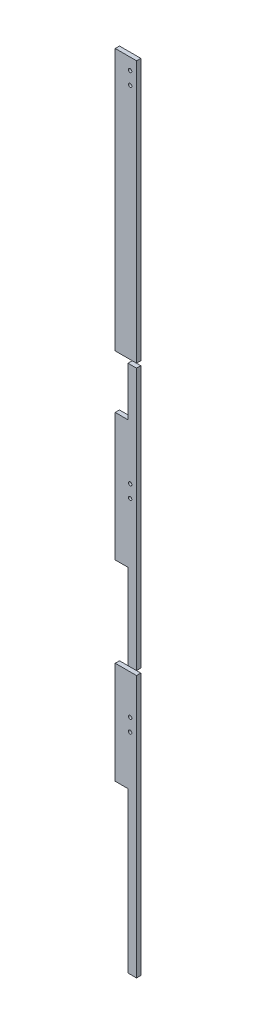
ISO-10303-21;
HEADER;
FILE_DESCRIPTION(('STEP AP214'),'2;1');
FILE_NAME('part.step','',(''),(''),'','','');
FILE_SCHEMA(('AUTOMOTIVE_DESIGN { 1 0 10303 214 1 1 1 1 }'));
ENDSEC;
DATA;
#1=APPLICATION_CONTEXT('core data for automotive mechanical design processes');
#2=APPLICATION_PROTOCOL_DEFINITION('international standard','automotive_design',2000,#1);
#3=PRODUCT_CONTEXT('',#1,'mechanical');
#4=PRODUCT('Part','Part','',(#3));
#5=PRODUCT_RELATED_PRODUCT_CATEGORY('part','',(#4));
#6=PRODUCT_DEFINITION_FORMATION('','',#4);
#7=PRODUCT_DEFINITION_CONTEXT('part definition',#1,'design');
#8=PRODUCT_DEFINITION('design','',#6,#7);
#9=PRODUCT_DEFINITION_SHAPE('','',#8);
#10=(LENGTH_UNIT() NAMED_UNIT(*) SI_UNIT(.MILLI.,.METRE.));
#11=(NAMED_UNIT(*) PLANE_ANGLE_UNIT() SI_UNIT($,.RADIAN.));
#12=(NAMED_UNIT(*) SI_UNIT($,.STERADIAN.) SOLID_ANGLE_UNIT());
#13=UNCERTAINTY_MEASURE_WITH_UNIT(LENGTH_MEASURE(1.E-05),#10,'distance_accuracy_value','');
#14=(GEOMETRIC_REPRESENTATION_CONTEXT(3) GLOBAL_UNCERTAINTY_ASSIGNED_CONTEXT((#13)) GLOBAL_UNIT_ASSIGNED_CONTEXT((#10,
#11,#12)) REPRESENTATION_CONTEXT('',''));
#15=CARTESIAN_POINT('',(0.,0.,0.));
#16=DIRECTION('',(0.,0.,1.));
#17=DIRECTION('',(1.,0.,0.));
#18=AXIS2_PLACEMENT_3D('',#15,#16,#17);
#19=CARTESIAN_POINT('',(0.,0.,2.));
#20=DIRECTION('',(0.,0.,-1.));
#21=DIRECTION('',(-1.,0.,0.));
#22=AXIS2_PLACEMENT_3D('',#19,#20,#21);
#23=PLANE('',#22);
#24=DIRECTION('',(0.,-1.,0.));
#25=VECTOR('',#24,1.);
#26=CARTESIAN_POINT('',(126.787596037725,-1065.01,2.));
#27=LINE('',#26,#25);
#28=CARTESIAN_POINT('',(126.787596037725,-1065.01,2.));
#29=VERTEX_POINT('',#28);
#30=CARTESIAN_POINT('',(126.787596037725,-1140.01,2.));
#31=VERTEX_POINT('',#30);
#32=EDGE_CURVE('E152',#29,#31,#27,.T.);
#33=ORIENTED_EDGE('',*,*,#32,.T.);
#34=DIRECTION('',(1.,0.,0.));
#35=VECTOR('',#34,1.);
#36=CARTESIAN_POINT('',(130.787596037725,-1140.01,2.));
#37=LINE('',#36,#35);
#38=CARTESIAN_POINT('',(130.787596037725,-1140.01,2.));
#39=VERTEX_POINT('',#38);
#40=EDGE_CURVE('E91',#31,#39,#37,.T.);
#41=ORIENTED_EDGE('',*,*,#40,.T.);
#42=DIRECTION('',(0.,1.,0.));
#43=VECTOR('',#42,1.);
#44=CARTESIAN_POINT('',(130.787596037725,-1076.01,2.));
#45=LINE('',#44,#43);
#46=CARTESIAN_POINT('',(130.787596037725,-1017.01,2.));
#47=VERTEX_POINT('',#46);
#48=EDGE_CURVE('E149',#39,#47,#45,.T.);
#49=ORIENTED_EDGE('',*,*,#48,.T.);
#50=DIRECTION('',(-1.,0.,0.));
#51=VECTOR('',#50,1.);
#52=CARTESIAN_POINT('',(120.787596037725,-1017.01,2.));
#53=LINE('',#52,#51);
#54=CARTESIAN_POINT('',(120.787596037725,-1017.01,2.));
#55=VERTEX_POINT('',#54);
#56=EDGE_CURVE('E127',#47,#55,#53,.T.);
#57=ORIENTED_EDGE('',*,*,#56,.T.);
#58=DIRECTION('',(0.,-1.,0.));
#59=VECTOR('',#58,1.);
#60=CARTESIAN_POINT('',(120.787596037725,-1017.01,2.));
#61=LINE('',#60,#59);
#62=CARTESIAN_POINT('',(120.787596037725,-1065.01,2.));
#63=VERTEX_POINT('',#62);
#64=EDGE_CURVE('E145',#55,#63,#61,.T.);
#65=ORIENTED_EDGE('',*,*,#64,.T.);
#66=DIRECTION('',(1.,0.,0.));
#67=VECTOR('',#66,1.);
#68=CARTESIAN_POINT('',(120.787596037725,-1065.01,2.));
#69=LINE('',#68,#67);
#70=EDGE_CURVE('E143',#63,#29,#69,.T.);
#71=ORIENTED_EDGE('',*,*,#70,.T.);
#72=EDGE_LOOP('',(#33,#41,#49,#57,#65,#71));
#73=FACE_BOUND('',#72,.T.);
#74=CARTESIAN_POINT('',(127.787596037728,-1035.51,2.));
#75=DIRECTION('',(0.,0.,1.));
#76=DIRECTION('',(1.,0.,0.));
#77=AXIS2_PLACEMENT_3D('',#74,#75,#76);
#78=CIRCLE('',#77,0.799999999999957);
#79=CARTESIAN_POINT('',(128.587596037728,-1035.51,2.));
#80=VERTEX_POINT('',#79);
#81=EDGE_CURVE('E142',#80,#80,#78,.T.);
#82=ORIENTED_EDGE('',*,*,#81,.F.);
#83=EDGE_LOOP('',(#82));
#84=FACE_BOUND('',#83,.T.);
#85=CARTESIAN_POINT('',(127.787596037728,-1041.51,2.));
#86=DIRECTION('',(0.,0.,1.));
#87=DIRECTION('',(1.,0.,0.));
#88=AXIS2_PLACEMENT_3D('',#85,#86,#87);
#89=CIRCLE('',#88,0.799999999999957);
#90=CARTESIAN_POINT('',(128.587596037728,-1041.51,2.));
#91=VERTEX_POINT('',#90);
#92=EDGE_CURVE('E56',#91,#91,#89,.T.);
#93=ORIENTED_EDGE('',*,*,#92,.F.);
#94=EDGE_LOOP('',(#93));
#95=FACE_BOUND('',#94,.T.);
#96=ADVANCED_FACE('F52',(#73,#84,#95),#23,.F.);
#97=CARTESIAN_POINT('',(0.,0.,0.));
#98=DIRECTION('',(0.,0.,-1.));
#99=DIRECTION('',(-1.,0.,0.));
#100=AXIS2_PLACEMENT_3D('',#97,#98,#99);
#101=PLANE('',#100);
#102=CARTESIAN_POINT('',(127.787596037728,-1035.51,0.));
#103=DIRECTION('',(0.,0.,1.));
#104=DIRECTION('',(1.,0.,0.));
#105=AXIS2_PLACEMENT_3D('',#102,#103,#104);
#106=CIRCLE('',#105,0.799999999999957);
#107=CARTESIAN_POINT('',(128.587596037728,-1035.51,0.));
#108=VERTEX_POINT('',#107);
#109=EDGE_CURVE('E154',#108,#108,#106,.T.);
#110=ORIENTED_EDGE('',*,*,#109,.T.);
#111=EDGE_LOOP('',(#110));
#112=FACE_BOUND('',#111,.T.);
#113=DIRECTION('',(0.,-1.,0.));
#114=VECTOR('',#113,1.);
#115=CARTESIAN_POINT('',(126.787596037725,-1065.01,0.));
#116=LINE('',#115,#114);
#117=CARTESIAN_POINT('',(126.787596037725,-1065.01,0.));
#118=VERTEX_POINT('',#117);
#119=CARTESIAN_POINT('',(126.787596037725,-1140.01,0.));
#120=VERTEX_POINT('',#119);
#121=EDGE_CURVE('E139',#118,#120,#116,.T.);
#122=ORIENTED_EDGE('',*,*,#121,.F.);
#123=DIRECTION('',(1.,0.,0.));
#124=VECTOR('',#123,1.);
#125=CARTESIAN_POINT('',(120.787596037725,-1065.01,0.));
#126=LINE('',#125,#124);
#127=CARTESIAN_POINT('',(120.787596037725,-1065.01,0.));
#128=VERTEX_POINT('',#127);
#129=EDGE_CURVE('E102',#128,#118,#126,.T.);
#130=ORIENTED_EDGE('',*,*,#129,.F.);
#131=DIRECTION('',(0.,-1.,0.));
#132=VECTOR('',#131,1.);
#133=CARTESIAN_POINT('',(120.787596037725,-1017.01,0.));
#134=LINE('',#133,#132);
#135=CARTESIAN_POINT('',(120.787596037725,-1017.01,0.));
#136=VERTEX_POINT('',#135);
#137=EDGE_CURVE('E133',#136,#128,#134,.T.);
#138=ORIENTED_EDGE('',*,*,#137,.F.);
#139=DIRECTION('',(-1.,0.,0.));
#140=VECTOR('',#139,1.);
#141=CARTESIAN_POINT('',(120.787596037725,-1017.01,0.));
#142=LINE('',#141,#140);
#143=CARTESIAN_POINT('',(130.787596037725,-1017.01,0.));
#144=VERTEX_POINT('',#143);
#145=EDGE_CURVE('E121',#144,#136,#142,.T.);
#146=ORIENTED_EDGE('',*,*,#145,.F.);
#147=DIRECTION('',(0.,1.,0.));
#148=VECTOR('',#147,1.);
#149=CARTESIAN_POINT('',(130.787596037725,-1017.01,0.));
#150=LINE('',#149,#148);
#151=CARTESIAN_POINT('',(130.787596037725,-1140.01,0.));
#152=VERTEX_POINT('',#151);
#153=EDGE_CURVE('E113',#152,#144,#150,.T.);
#154=ORIENTED_EDGE('',*,*,#153,.F.);
#155=DIRECTION('',(1.,0.,0.));
#156=VECTOR('',#155,1.);
#157=CARTESIAN_POINT('',(130.787596037725,-1140.01,0.));
#158=LINE('',#157,#156);
#159=EDGE_CURVE('E69',#120,#152,#158,.T.);
#160=ORIENTED_EDGE('',*,*,#159,.F.);
#161=EDGE_LOOP('',(#122,#130,#138,#146,#154,#160));
#162=FACE_BOUND('',#161,.T.);
#163=CARTESIAN_POINT('',(127.787596037728,-1041.51,0.));
#164=DIRECTION('',(0.,0.,1.));
#165=DIRECTION('',(1.,0.,0.));
#166=AXIS2_PLACEMENT_3D('',#163,#164,#165);
#167=CIRCLE('',#166,0.799999999999957);
#168=CARTESIAN_POINT('',(128.587596037728,-1041.51,0.));
#169=VERTEX_POINT('',#168);
#170=EDGE_CURVE('E12',#169,#169,#167,.T.);
#171=ORIENTED_EDGE('',*,*,#170,.T.);
#172=EDGE_LOOP('',(#171));
#173=FACE_BOUND('',#172,.T.);
#174=ADVANCED_FACE('F131',(#112,#162,#173),#101,.T.);
#175=CARTESIAN_POINT('',(126.787596037725,-1065.01,2.));
#176=DIRECTION('',(1.,0.,0.));
#177=DIRECTION('',(0.,1.,0.));
#178=AXIS2_PLACEMENT_3D('',#175,#176,#177);
#179=PLANE('',#178);
#180=ORIENTED_EDGE('',*,*,#121,.T.);
#181=DIRECTION('',(0.,0.,-1.));
#182=VECTOR('',#181,1.);
#183=CARTESIAN_POINT('',(126.787596037725,-1140.01,2.));
#184=LINE('',#183,#182);
#185=EDGE_CURVE('E205',#31,#120,#184,.T.);
#186=ORIENTED_EDGE('',*,*,#185,.F.);
#187=ORIENTED_EDGE('',*,*,#32,.F.);
#188=DIRECTION('',(0.,0.,-1.));
#189=VECTOR('',#188,1.);
#190=CARTESIAN_POINT('',(126.787596037725,-1065.01,2.));
#191=LINE('',#190,#189);
#192=EDGE_CURVE('E146',#29,#118,#191,.T.);
#193=ORIENTED_EDGE('',*,*,#192,.T.);
#194=EDGE_LOOP('',(#180,#186,#187,#193));
#195=FACE_BOUND('',#194,.T.);
#196=ADVANCED_FACE('F173',(#195),#179,.F.);
#197=CARTESIAN_POINT('',(130.787596037725,-1140.01,2.));
#198=DIRECTION('',(0.,1.,0.));
#199=DIRECTION('',(0.,0.,1.));
#200=AXIS2_PLACEMENT_3D('',#197,#198,#199);
#201=PLANE('',#200);
#202=ORIENTED_EDGE('',*,*,#159,.T.);
#203=DIRECTION('',(0.,0.,-1.));
#204=VECTOR('',#203,1.);
#205=CARTESIAN_POINT('',(130.787596037725,-1140.01,2.));
#206=LINE('',#205,#204);
#207=EDGE_CURVE('E119',#39,#152,#206,.T.);
#208=ORIENTED_EDGE('',*,*,#207,.F.);
#209=ORIENTED_EDGE('',*,*,#40,.F.);
#210=ORIENTED_EDGE('',*,*,#185,.T.);
#211=EDGE_LOOP('',(#202,#208,#209,#210));
#212=FACE_BOUND('',#211,.T.);
#213=ADVANCED_FACE('F179',(#212),#201,.F.);
#214=CARTESIAN_POINT('',(130.787596037725,-1017.01,2.));
#215=DIRECTION('',(-1.,0.,0.));
#216=DIRECTION('',(0.,-1.,0.));
#217=AXIS2_PLACEMENT_3D('',#214,#215,#216);
#218=PLANE('',#217);
#219=ORIENTED_EDGE('',*,*,#153,.T.);
#220=DIRECTION('',(0.,0.,-1.));
#221=VECTOR('',#220,1.);
#222=CARTESIAN_POINT('',(130.787596037725,-1017.01,2.));
#223=LINE('',#222,#221);
#224=EDGE_CURVE('E117',#47,#144,#223,.T.);
#225=ORIENTED_EDGE('',*,*,#224,.F.);
#226=ORIENTED_EDGE('',*,*,#48,.F.);
#227=ORIENTED_EDGE('',*,*,#207,.T.);
#228=EDGE_LOOP('',(#219,#225,#226,#227));
#229=FACE_BOUND('',#228,.T.);
#230=ADVANCED_FACE('F115',(#229),#218,.F.);
#231=CARTESIAN_POINT('',(120.787596037725,-1017.01,2.));
#232=DIRECTION('',(0.,-1.,0.));
#233=DIRECTION('',(0.,0.,-1.));
#234=AXIS2_PLACEMENT_3D('',#231,#232,#233);
#235=PLANE('',#234);
#236=ORIENTED_EDGE('',*,*,#145,.T.);
#237=DIRECTION('',(0.,0.,-1.));
#238=VECTOR('',#237,1.);
#239=CARTESIAN_POINT('',(120.787596037725,-1017.01,2.));
#240=LINE('',#239,#238);
#241=EDGE_CURVE('E128',#55,#136,#240,.T.);
#242=ORIENTED_EDGE('',*,*,#241,.F.);
#243=ORIENTED_EDGE('',*,*,#56,.F.);
#244=ORIENTED_EDGE('',*,*,#224,.T.);
#245=EDGE_LOOP('',(#236,#242,#243,#244));
#246=FACE_BOUND('',#245,.T.);
#247=ADVANCED_FACE('F124',(#246),#235,.F.);
#248=CARTESIAN_POINT('',(120.787596037725,-1017.01,2.));
#249=DIRECTION('',(1.,0.,0.));
#250=DIRECTION('',(0.,1.,0.));
#251=AXIS2_PLACEMENT_3D('',#248,#249,#250);
#252=PLANE('',#251);
#253=ORIENTED_EDGE('',*,*,#137,.T.);
#254=DIRECTION('',(0.,0.,-1.));
#255=VECTOR('',#254,1.);
#256=CARTESIAN_POINT('',(120.787596037725,-1065.01,2.));
#257=LINE('',#256,#255);
#258=EDGE_CURVE('E210',#63,#128,#257,.T.);
#259=ORIENTED_EDGE('',*,*,#258,.F.);
#260=ORIENTED_EDGE('',*,*,#64,.F.);
#261=ORIENTED_EDGE('',*,*,#241,.T.);
#262=EDGE_LOOP('',(#253,#259,#260,#261));
#263=FACE_BOUND('',#262,.T.);
#264=ADVANCED_FACE('F189',(#263),#252,.F.);
#265=CARTESIAN_POINT('',(120.787596037725,-1065.01,2.));
#266=DIRECTION('',(0.,1.,0.));
#267=DIRECTION('',(0.,0.,1.));
#268=AXIS2_PLACEMENT_3D('',#265,#266,#267);
#269=PLANE('',#268);
#270=ORIENTED_EDGE('',*,*,#129,.T.);
#271=ORIENTED_EDGE('',*,*,#192,.F.);
#272=ORIENTED_EDGE('',*,*,#70,.F.);
#273=ORIENTED_EDGE('',*,*,#258,.T.);
#274=EDGE_LOOP('',(#270,#271,#272,#273));
#275=FACE_BOUND('',#274,.T.);
#276=ADVANCED_FACE('F183',(#275),#269,.F.);
#277=CARTESIAN_POINT('',(127.787596037728,-1035.51,2.));
#278=DIRECTION('',(0.,0.,-1.));
#279=DIRECTION('',(-1.,0.,0.));
#280=AXIS2_PLACEMENT_3D('',#277,#278,#279);
#281=CYLINDRICAL_SURFACE('',#280,0.799999999999957);
#282=ORIENTED_EDGE('',*,*,#81,.T.);
#283=EDGE_LOOP('',(#282));
#284=FACE_BOUND('',#283,.T.);
#285=ORIENTED_EDGE('',*,*,#109,.F.);
#286=EDGE_LOOP('',(#285));
#287=FACE_BOUND('',#286,.T.);
#288=ADVANCED_FACE('F160',(#284,#287),#281,.F.);
#289=CARTESIAN_POINT('',(127.787596037728,-1041.51,2.));
#290=DIRECTION('',(0.,0.,-1.));
#291=DIRECTION('',(-1.,0.,0.));
#292=AXIS2_PLACEMENT_3D('',#289,#290,#291);
#293=CYLINDRICAL_SURFACE('',#292,0.799999999999957);
#294=ORIENTED_EDGE('',*,*,#92,.T.);
#295=EDGE_LOOP('',(#294));
#296=FACE_BOUND('',#295,.T.);
#297=ORIENTED_EDGE('',*,*,#170,.F.);
#298=EDGE_LOOP('',(#297));
#299=FACE_BOUND('',#298,.T.);
#300=ADVANCED_FACE('F54',(#296,#299),#293,.F.);
#301=CLOSED_SHELL('',(#96,#174,#196,#213,#230,#247,#264,#276,#288,#300));
#302=MANIFOLD_SOLID_BREP('B2',#301);
#303=CARTESIAN_POINT('',(0.,0.,2.));
#304=DIRECTION('',(0.,0.,-1.));
#305=DIRECTION('',(-1.,0.,0.));
#306=AXIS2_PLACEMENT_3D('',#303,#304,#305);
#307=PLANE('',#306);
#308=DIRECTION('',(0.,-1.,0.));
#309=VECTOR('',#308,1.);
#310=CARTESIAN_POINT('',(120.787596037725,-975.01,2.));
#311=LINE('',#310,#309);
#312=CARTESIAN_POINT('',(120.787596037725,-915.01,2.));
#313=VERTEX_POINT('',#312);
#314=CARTESIAN_POINT('',(120.787596037725,-975.01,2.));
#315=VERTEX_POINT('',#314);
#316=EDGE_CURVE('E400',#313,#315,#311,.T.);
#317=ORIENTED_EDGE('',*,*,#316,.T.);
#318=DIRECTION('',(1.,0.,0.));
#319=VECTOR('',#318,1.);
#320=CARTESIAN_POINT('',(120.787596037725,-975.01,2.));
#321=LINE('',#320,#319);
#322=CARTESIAN_POINT('',(126.787596037725,-975.01,2.));
#323=VERTEX_POINT('',#322);
#324=EDGE_CURVE('E327',#315,#323,#321,.T.);
#325=ORIENTED_EDGE('',*,*,#324,.T.);
#326=DIRECTION('',(0.,-1.,0.));
#327=VECTOR('',#326,1.);
#328=CARTESIAN_POINT('',(126.787596037725,-975.01,2.));
#329=LINE('',#328,#327);
#330=CARTESIAN_POINT('',(126.787596037725,-1015.01,2.));
#331=VERTEX_POINT('',#330);
#332=EDGE_CURVE('E397',#323,#331,#329,.T.);
#333=ORIENTED_EDGE('',*,*,#332,.T.);
#334=DIRECTION('',(1.,0.,0.));
#335=VECTOR('',#334,1.);
#336=CARTESIAN_POINT('',(130.787596037725,-1015.01,2.));
#337=LINE('',#336,#335);
#338=CARTESIAN_POINT('',(130.787596037725,-1015.01,2.));
#339=VERTEX_POINT('',#338);
#340=EDGE_CURVE('E370',#331,#339,#337,.T.);
#341=ORIENTED_EDGE('',*,*,#340,.T.);
#342=DIRECTION('',(0.,1.,0.));
#343=VECTOR('',#342,1.);
#344=CARTESIAN_POINT('',(130.787596037725,-985.01,2.));
#345=LINE('',#344,#343);
#346=CARTESIAN_POINT('',(130.787596037725,-892.01,2.));
#347=VERTEX_POINT('',#346);
#348=EDGE_CURVE('E394',#339,#347,#345,.T.);
#349=ORIENTED_EDGE('',*,*,#348,.T.);
#350=DIRECTION('',(-1.,0.,0.));
#351=VECTOR('',#350,1.);
#352=CARTESIAN_POINT('',(130.787596037725,-892.01,2.));
#353=LINE('',#352,#351);
#354=CARTESIAN_POINT('',(126.787596037725,-892.01,2.));
#355=VERTEX_POINT('',#354);
#356=EDGE_CURVE('E392',#347,#355,#353,.T.);
#357=ORIENTED_EDGE('',*,*,#356,.T.);
#358=DIRECTION('',(0.,-1.,0.));
#359=VECTOR('',#358,1.);
#360=CARTESIAN_POINT('',(126.787596037725,-892.01,2.));
#361=LINE('',#360,#359);
#362=CARTESIAN_POINT('',(126.787596037725,-915.01,2.));
#363=VERTEX_POINT('',#362);
#364=EDGE_CURVE('E389',#355,#363,#361,.T.);
#365=ORIENTED_EDGE('',*,*,#364,.T.);
#366=DIRECTION('',(-1.,0.,0.));
#367=VECTOR('',#366,1.);
#368=CARTESIAN_POINT('',(120.787596037725,-915.01,2.));
#369=LINE('',#368,#367);
#370=EDGE_CURVE('E387',#363,#313,#369,.T.);
#371=ORIENTED_EDGE('',*,*,#370,.T.);
#372=EDGE_LOOP('',(#317,#325,#333,#341,#349,#357,#365,#371));
#373=FACE_BOUND('',#372,.T.);
#374=CARTESIAN_POINT('',(127.787596037727,-940.51,2.));
#375=DIRECTION('',(0.,0.,1.));
#376=DIRECTION('',(1.,0.,0.));
#377=AXIS2_PLACEMENT_3D('',#374,#375,#376);
#378=CIRCLE('',#377,0.799999999999989);
#379=CARTESIAN_POINT('',(128.587596037727,-940.51,2.));
#380=VERTEX_POINT('',#379);
#381=EDGE_CURVE('E386',#380,#380,#378,.T.);
#382=ORIENTED_EDGE('',*,*,#381,.F.);
#383=EDGE_LOOP('',(#382));
#384=FACE_BOUND('',#383,.T.);
#385=CARTESIAN_POINT('',(127.787596037727,-946.51,2.));
#386=DIRECTION('',(0.,0.,1.));
#387=DIRECTION('',(1.,0.,0.));
#388=AXIS2_PLACEMENT_3D('',#385,#386,#387);
#389=CIRCLE('',#388,0.799999999999989);
#390=CARTESIAN_POINT('',(128.587596037727,-946.51,2.));
#391=VERTEX_POINT('',#390);
#392=EDGE_CURVE('E286',#391,#391,#389,.T.);
#393=ORIENTED_EDGE('',*,*,#392,.F.);
#394=EDGE_LOOP('',(#393));
#395=FACE_BOUND('',#394,.T.);
#396=ADVANCED_FACE('F282',(#373,#384,#395),#307,.F.);
#397=CARTESIAN_POINT('',(0.,0.,0.));
#398=DIRECTION('',(0.,0.,-1.));
#399=DIRECTION('',(-1.,0.,0.));
#400=AXIS2_PLACEMENT_3D('',#397,#398,#399);
#401=PLANE('',#400);
#402=CARTESIAN_POINT('',(127.787596037727,-940.51,0.));
#403=DIRECTION('',(0.,0.,1.));
#404=DIRECTION('',(1.,0.,0.));
#405=AXIS2_PLACEMENT_3D('',#402,#403,#404);
#406=CIRCLE('',#405,0.799999999999989);
#407=CARTESIAN_POINT('',(128.587596037727,-940.51,0.));
#408=VERTEX_POINT('',#407);
#409=EDGE_CURVE('E402',#408,#408,#406,.T.);
#410=ORIENTED_EDGE('',*,*,#409,.T.);
#411=EDGE_LOOP('',(#410));
#412=FACE_BOUND('',#411,.T.);
#413=DIRECTION('',(0.,-1.,0.));
#414=VECTOR('',#413,1.);
#415=CARTESIAN_POINT('',(120.787596037725,-975.01,0.));
#416=LINE('',#415,#414);
#417=CARTESIAN_POINT('',(120.787596037725,-915.01,0.));
#418=VERTEX_POINT('',#417);
#419=CARTESIAN_POINT('',(120.787596037725,-975.01,0.));
#420=VERTEX_POINT('',#419);
#421=EDGE_CURVE('E383',#418,#420,#416,.T.);
#422=ORIENTED_EDGE('',*,*,#421,.F.);
#423=DIRECTION('',(-1.,0.,0.));
#424=VECTOR('',#423,1.);
#425=CARTESIAN_POINT('',(120.787596037725,-915.01,0.));
#426=LINE('',#425,#424);
#427=CARTESIAN_POINT('',(126.787596037725,-915.01,0.));
#428=VERTEX_POINT('',#427);
#429=EDGE_CURVE('E338',#428,#418,#426,.T.);
#430=ORIENTED_EDGE('',*,*,#429,.F.);
#431=DIRECTION('',(0.,-1.,0.));
#432=VECTOR('',#431,1.);
#433=CARTESIAN_POINT('',(126.787596037725,-892.01,0.));
#434=LINE('',#433,#432);
#435=CARTESIAN_POINT('',(126.787596037725,-892.01,0.));
#436=VERTEX_POINT('',#435);
#437=EDGE_CURVE('E465',#436,#428,#434,.T.);
#438=ORIENTED_EDGE('',*,*,#437,.F.);
#439=DIRECTION('',(-1.,0.,0.));
#440=VECTOR('',#439,1.);
#441=CARTESIAN_POINT('',(130.787596037725,-892.01,0.));
#442=LINE('',#441,#440);
#443=CARTESIAN_POINT('',(130.787596037725,-892.01,0.));
#444=VERTEX_POINT('',#443);
#445=EDGE_CURVE('E378',#444,#436,#442,.T.);
#446=ORIENTED_EDGE('',*,*,#445,.F.);
#447=DIRECTION('',(0.,1.,0.));
#448=VECTOR('',#447,1.);
#449=CARTESIAN_POINT('',(130.787596037725,-892.01,0.));
#450=LINE('',#449,#448);
#451=CARTESIAN_POINT('',(130.787596037725,-1015.01,0.));
#452=VERTEX_POINT('',#451);
#453=EDGE_CURVE('E376',#452,#444,#450,.T.);
#454=ORIENTED_EDGE('',*,*,#453,.F.);
#455=DIRECTION('',(1.,0.,0.));
#456=VECTOR('',#455,1.);
#457=CARTESIAN_POINT('',(130.787596037725,-1015.01,0.));
#458=LINE('',#457,#456);
#459=CARTESIAN_POINT('',(126.787596037725,-1015.01,0.));
#460=VERTEX_POINT('',#459);
#461=EDGE_CURVE('E363',#460,#452,#458,.T.);
#462=ORIENTED_EDGE('',*,*,#461,.F.);
#463=DIRECTION('',(0.,-1.,0.));
#464=VECTOR('',#463,1.);
#465=CARTESIAN_POINT('',(126.787596037725,-975.01,0.));
#466=LINE('',#465,#464);
#467=CARTESIAN_POINT('',(126.787596037725,-975.01,0.));
#468=VERTEX_POINT('',#467);
#469=EDGE_CURVE('E355',#468,#460,#466,.T.);
#470=ORIENTED_EDGE('',*,*,#469,.F.);
#471=DIRECTION('',(1.,0.,0.));
#472=VECTOR('',#471,1.);
#473=CARTESIAN_POINT('',(120.787596037725,-975.01,0.));
#474=LINE('',#473,#472);
#475=EDGE_CURVE('E299',#420,#468,#474,.T.);
#476=ORIENTED_EDGE('',*,*,#475,.F.);
#477=EDGE_LOOP('',(#422,#430,#438,#446,#454,#462,#470,#476));
#478=FACE_BOUND('',#477,.T.);
#479=CARTESIAN_POINT('',(127.787596037727,-946.51,0.));
#480=DIRECTION('',(0.,0.,1.));
#481=DIRECTION('',(1.,0.,0.));
#482=AXIS2_PLACEMENT_3D('',#479,#480,#481);
#483=CIRCLE('',#482,0.799999999999989);
#484=CARTESIAN_POINT('',(128.587596037727,-946.51,0.));
#485=VERTEX_POINT('',#484);
#486=EDGE_CURVE('E50',#485,#485,#483,.T.);
#487=ORIENTED_EDGE('',*,*,#486,.T.);
#488=EDGE_LOOP('',(#487));
#489=FACE_BOUND('',#488,.T.);
#490=ADVANCED_FACE('F373',(#412,#478,#489),#401,.T.);
#491=CARTESIAN_POINT('',(120.787596037725,-975.01,2.));
#492=DIRECTION('',(1.,0.,0.));
#493=DIRECTION('',(0.,0.,-1.));
#494=AXIS2_PLACEMENT_3D('',#491,#492,#493);
#495=PLANE('',#494);
#496=ORIENTED_EDGE('',*,*,#421,.T.);
#497=DIRECTION('',(0.,0.,-1.));
#498=VECTOR('',#497,1.);
#499=CARTESIAN_POINT('',(120.787596037725,-975.01,2.));
#500=LINE('',#499,#498);
#501=EDGE_CURVE('E461',#315,#420,#500,.T.);
#502=ORIENTED_EDGE('',*,*,#501,.F.);
#503=ORIENTED_EDGE('',*,*,#316,.F.);
#504=DIRECTION('',(0.,0.,-1.));
#505=VECTOR('',#504,1.);
#506=CARTESIAN_POINT('',(120.787596037725,-915.01,2.));
#507=LINE('',#506,#505);
#508=EDGE_CURVE('E390',#313,#418,#507,.T.);
#509=ORIENTED_EDGE('',*,*,#508,.T.);
#510=EDGE_LOOP('',(#496,#502,#503,#509));
#511=FACE_BOUND('',#510,.T.);
#512=ADVANCED_FACE('F421',(#511),#495,.F.);
#513=CARTESIAN_POINT('',(120.787596037725,-975.01,2.));
#514=DIRECTION('',(0.,1.,0.));
#515=DIRECTION('',(0.,0.,1.));
#516=AXIS2_PLACEMENT_3D('',#513,#514,#515);
#517=PLANE('',#516);
#518=ORIENTED_EDGE('',*,*,#475,.T.);
#519=DIRECTION('',(0.,0.,-1.));
#520=VECTOR('',#519,1.);
#521=CARTESIAN_POINT('',(126.787596037725,-975.01,2.));
#522=LINE('',#521,#520);
#523=EDGE_CURVE('E361',#323,#468,#522,.T.);
#524=ORIENTED_EDGE('',*,*,#523,.F.);
#525=ORIENTED_EDGE('',*,*,#324,.F.);
#526=ORIENTED_EDGE('',*,*,#501,.T.);
#527=EDGE_LOOP('',(#518,#524,#525,#526));
#528=FACE_BOUND('',#527,.T.);
#529=ADVANCED_FACE('F427',(#528),#517,.F.);
#530=CARTESIAN_POINT('',(126.787596037725,-975.01,2.));
#531=DIRECTION('',(1.,0.,0.));
#532=DIRECTION('',(0.,1.,0.));
#533=AXIS2_PLACEMENT_3D('',#530,#531,#532);
#534=PLANE('',#533);
#535=ORIENTED_EDGE('',*,*,#469,.T.);
#536=DIRECTION('',(0.,0.,-1.));
#537=VECTOR('',#536,1.);
#538=CARTESIAN_POINT('',(126.787596037725,-1015.01,2.));
#539=LINE('',#538,#537);
#540=EDGE_CURVE('E359',#331,#460,#539,.T.);
#541=ORIENTED_EDGE('',*,*,#540,.F.);
#542=ORIENTED_EDGE('',*,*,#332,.F.);
#543=ORIENTED_EDGE('',*,*,#523,.T.);
#544=EDGE_LOOP('',(#535,#541,#542,#543));
#545=FACE_BOUND('',#544,.T.);
#546=ADVANCED_FACE('F357',(#545),#534,.F.);
#547=CARTESIAN_POINT('',(130.787596037725,-1015.01,2.));
#548=DIRECTION('',(0.,1.,0.));
#549=DIRECTION('',(0.,0.,1.));
#550=AXIS2_PLACEMENT_3D('',#547,#548,#549);
#551=PLANE('',#550);
#552=ORIENTED_EDGE('',*,*,#461,.T.);
#553=DIRECTION('',(0.,0.,-1.));
#554=VECTOR('',#553,1.);
#555=CARTESIAN_POINT('',(130.787596037725,-1015.01,2.));
#556=LINE('',#555,#554);
#557=EDGE_CURVE('E371',#339,#452,#556,.T.);
#558=ORIENTED_EDGE('',*,*,#557,.F.);
#559=ORIENTED_EDGE('',*,*,#340,.F.);
#560=ORIENTED_EDGE('',*,*,#540,.T.);
#561=EDGE_LOOP('',(#552,#558,#559,#560));
#562=FACE_BOUND('',#561,.T.);
#563=ADVANCED_FACE('F367',(#562),#551,.F.);
#564=CARTESIAN_POINT('',(130.787596037725,-892.01,2.));
#565=DIRECTION('',(-1.,0.,0.));
#566=DIRECTION('',(0.,0.,1.));
#567=AXIS2_PLACEMENT_3D('',#564,#565,#566);
#568=PLANE('',#567);
#569=ORIENTED_EDGE('',*,*,#453,.T.);
#570=DIRECTION('',(0.,0.,-1.));
#571=VECTOR('',#570,1.);
#572=CARTESIAN_POINT('',(130.787596037725,-892.01,2.));
#573=LINE('',#572,#571);
#574=EDGE_CURVE('E477',#347,#444,#573,.T.);
#575=ORIENTED_EDGE('',*,*,#574,.F.);
#576=ORIENTED_EDGE('',*,*,#348,.F.);
#577=ORIENTED_EDGE('',*,*,#557,.T.);
#578=EDGE_LOOP('',(#569,#575,#576,#577));
#579=FACE_BOUND('',#578,.T.);
#580=ADVANCED_FACE('F446',(#579),#568,.F.);
#581=CARTESIAN_POINT('',(130.787596037725,-892.01,2.));
#582=DIRECTION('',(0.,-1.,0.));
#583=DIRECTION('',(0.,0.,-1.));
#584=AXIS2_PLACEMENT_3D('',#581,#582,#583);
#585=PLANE('',#584);
#586=ORIENTED_EDGE('',*,*,#445,.T.);
#587=DIRECTION('',(0.,0.,-1.));
#588=VECTOR('',#587,1.);
#589=CARTESIAN_POINT('',(126.787596037725,-892.01,2.));
#590=LINE('',#589,#588);
#591=EDGE_CURVE('E474',#355,#436,#590,.T.);
#592=ORIENTED_EDGE('',*,*,#591,.F.);
#593=ORIENTED_EDGE('',*,*,#356,.F.);
#594=ORIENTED_EDGE('',*,*,#574,.T.);
#595=EDGE_LOOP('',(#586,#592,#593,#594));
#596=FACE_BOUND('',#595,.T.);
#597=ADVANCED_FACE('F441',(#596),#585,.F.);
#598=CARTESIAN_POINT('',(126.787596037725,-892.01,2.));
#599=DIRECTION('',(1.,0.,0.));
#600=DIRECTION('',(0.,0.,-1.));
#601=AXIS2_PLACEMENT_3D('',#598,#599,#600);
#602=PLANE('',#601);
#603=ORIENTED_EDGE('',*,*,#437,.T.);
#604=DIRECTION('',(0.,0.,-1.));
#605=VECTOR('',#604,1.);
#606=CARTESIAN_POINT('',(126.787596037725,-915.01,2.));
#607=LINE('',#606,#605);
#608=EDGE_CURVE('E479',#363,#428,#607,.T.);
#609=ORIENTED_EDGE('',*,*,#608,.F.);
#610=ORIENTED_EDGE('',*,*,#364,.F.);
#611=ORIENTED_EDGE('',*,*,#591,.T.);
#612=EDGE_LOOP('',(#603,#609,#610,#611));
#613=FACE_BOUND('',#612,.T.);
#614=ADVANCED_FACE('F437',(#613),#602,.F.);
#615=CARTESIAN_POINT('',(120.787596037725,-915.01,2.));
#616=DIRECTION('',(0.,-1.,0.));
#617=DIRECTION('',(0.,0.,-1.));
#618=AXIS2_PLACEMENT_3D('',#615,#616,#617);
#619=PLANE('',#618);
#620=ORIENTED_EDGE('',*,*,#429,.T.);
#621=ORIENTED_EDGE('',*,*,#508,.F.);
#622=ORIENTED_EDGE('',*,*,#370,.F.);
#623=ORIENTED_EDGE('',*,*,#608,.T.);
#624=EDGE_LOOP('',(#620,#621,#622,#623));
#625=FACE_BOUND('',#624,.T.);
#626=ADVANCED_FACE('F431',(#625),#619,.F.);
#627=CARTESIAN_POINT('',(127.787596037727,-940.51,2.));
#628=DIRECTION('',(0.,0.,-1.));
#629=DIRECTION('',(-1.,0.,0.));
#630=AXIS2_PLACEMENT_3D('',#627,#628,#629);
#631=CYLINDRICAL_SURFACE('',#630,0.799999999999989);
#632=ORIENTED_EDGE('',*,*,#381,.T.);
#633=EDGE_LOOP('',(#632));
#634=FACE_BOUND('',#633,.T.);
#635=ORIENTED_EDGE('',*,*,#409,.F.);
#636=EDGE_LOOP('',(#635));
#637=FACE_BOUND('',#636,.T.);
#638=ADVANCED_FACE('F408',(#634,#637),#631,.F.);
#639=CARTESIAN_POINT('',(127.787596037727,-946.51,2.));
#640=DIRECTION('',(0.,0.,-1.));
#641=DIRECTION('',(-1.,0.,0.));
#642=AXIS2_PLACEMENT_3D('',#639,#640,#641);
#643=CYLINDRICAL_SURFACE('',#642,0.799999999999989);
#644=ORIENTED_EDGE('',*,*,#392,.T.);
#645=EDGE_LOOP('',(#644));
#646=FACE_BOUND('',#645,.T.);
#647=ORIENTED_EDGE('',*,*,#486,.F.);
#648=EDGE_LOOP('',(#647));
#649=FACE_BOUND('',#648,.T.);
#650=ADVANCED_FACE('F284',(#646,#649),#643,.F.);
#651=CLOSED_SHELL('',(#396,#490,#512,#529,#546,#563,#580,#597,#614,#626,#638,#650));
#652=MANIFOLD_SOLID_BREP('B6',#651);
#653=CARTESIAN_POINT('',(0.,0.,2.));
#654=DIRECTION('',(0.,0.,1.));
#655=DIRECTION('',(1.,0.,0.));
#656=AXIS2_PLACEMENT_3D('',#653,#654,#655);
#657=PLANE('',#656);
#658=CARTESIAN_POINT('',(127.787596037725,-772.51,2.));
#659=DIRECTION('',(0.,0.,1.));
#660=DIRECTION('',(1.,0.,0.));
#661=AXIS2_PLACEMENT_3D('',#658,#659,#660);
#662=CIRCLE('',#661,0.799999999999989);
#663=CARTESIAN_POINT('',(128.587596037725,-772.51,2.));
#664=VERTEX_POINT('',#663);
#665=EDGE_CURVE('E625',#664,#664,#662,.T.);
#666=ORIENTED_EDGE('',*,*,#665,.F.);
#667=EDGE_LOOP('',(#666));
#668=FACE_BOUND('',#667,.T.);
#669=DIRECTION('',(0.,-1.,0.));
#670=VECTOR('',#669,1.);
#671=CARTESIAN_POINT('',(120.787596037725,-767.01,2.));
#672=LINE('',#671,#670);
#673=CARTESIAN_POINT('',(120.787596037725,-767.01,2.));
#674=VERTEX_POINT('',#673);
#675=CARTESIAN_POINT('',(120.787596037725,-890.01,2.));
#676=VERTEX_POINT('',#675);
#677=EDGE_CURVE('E610',#674,#676,#672,.T.);
#678=ORIENTED_EDGE('',*,*,#677,.T.);
#679=DIRECTION('',(1.,0.,0.));
#680=VECTOR('',#679,1.);
#681=CARTESIAN_POINT('',(120.787596037725,-890.01,2.));
#682=LINE('',#681,#680);
#683=CARTESIAN_POINT('',(130.787596037725,-890.01,2.));
#684=VERTEX_POINT('',#683);
#685=EDGE_CURVE('E605',#676,#684,#682,.T.);
#686=ORIENTED_EDGE('',*,*,#685,.T.);
#687=DIRECTION('',(0.,1.,0.));
#688=VECTOR('',#687,1.);
#689=CARTESIAN_POINT('',(130.787596037725,-767.01,2.));
#690=LINE('',#689,#688);
#691=CARTESIAN_POINT('',(130.787596037725,-767.01,2.));
#692=VERTEX_POINT('',#691);
#693=EDGE_CURVE('E608',#684,#692,#690,.T.);
#694=ORIENTED_EDGE('',*,*,#693,.T.);
#695=DIRECTION('',(-1.,0.,0.));
#696=VECTOR('',#695,1.);
#697=CARTESIAN_POINT('',(120.787596037725,-767.01,2.));
#698=LINE('',#697,#696);
#699=EDGE_CURVE('E575',#692,#674,#698,.T.);
#700=ORIENTED_EDGE('',*,*,#699,.T.);
#701=EDGE_LOOP('',(#678,#686,#694,#700));
#702=FACE_BOUND('',#701,.T.);
#703=CARTESIAN_POINT('',(127.787596037725,-778.51,2.));
#704=DIRECTION('',(0.,0.,1.));
#705=DIRECTION('',(1.,0.,0.));
#706=AXIS2_PLACEMENT_3D('',#703,#704,#705);
#707=CIRCLE('',#706,0.799999999999989);
#708=CARTESIAN_POINT('',(128.587596037725,-778.51,2.));
#709=VERTEX_POINT('',#708);
#710=EDGE_CURVE('E640',#709,#709,#707,.T.);
#711=ORIENTED_EDGE('',*,*,#710,.F.);
#712=EDGE_LOOP('',(#711));
#713=FACE_BOUND('',#712,.T.);
#714=ADVANCED_FACE('F558',(#668,#702,#713),#657,.T.);
#715=CARTESIAN_POINT('',(0.,0.,0.));
#716=DIRECTION('',(0.,0.,1.));
#717=DIRECTION('',(1.,0.,0.));
#718=AXIS2_PLACEMENT_3D('',#715,#716,#717);
#719=PLANE('',#718);
#720=DIRECTION('',(0.,-1.,0.));
#721=VECTOR('',#720,1.);
#722=CARTESIAN_POINT('',(120.787596037725,-767.01,0.));
#723=LINE('',#722,#721);
#724=CARTESIAN_POINT('',(120.787596037725,-767.01,0.));
#725=VERTEX_POINT('',#724);
#726=CARTESIAN_POINT('',(120.787596037725,-890.01,0.));
#727=VERTEX_POINT('',#726);
#728=EDGE_CURVE('E622',#725,#727,#723,.T.);
#729=ORIENTED_EDGE('',*,*,#728,.F.);
#730=DIRECTION('',(-1.,0.,0.));
#731=VECTOR('',#730,1.);
#732=CARTESIAN_POINT('',(120.787596037725,-767.01,0.));
#733=LINE('',#732,#731);
#734=CARTESIAN_POINT('',(130.787596037725,-767.01,0.));
#735=VERTEX_POINT('',#734);
#736=EDGE_CURVE('E598',#735,#725,#733,.T.);
#737=ORIENTED_EDGE('',*,*,#736,.F.);
#738=DIRECTION('',(0.,1.,0.));
#739=VECTOR('',#738,1.);
#740=CARTESIAN_POINT('',(130.787596037725,-767.01,0.));
#741=LINE('',#740,#739);
#742=CARTESIAN_POINT('',(130.787596037725,-890.01,0.));
#743=VERTEX_POINT('',#742);
#744=EDGE_CURVE('E592',#743,#735,#741,.T.);
#745=ORIENTED_EDGE('',*,*,#744,.F.);
#746=DIRECTION('',(1.,0.,0.));
#747=VECTOR('',#746,1.);
#748=CARTESIAN_POINT('',(120.787596037725,-890.01,0.));
#749=LINE('',#748,#747);
#750=EDGE_CURVE('E614',#727,#743,#749,.T.);
#751=ORIENTED_EDGE('',*,*,#750,.F.);
#752=EDGE_LOOP('',(#729,#737,#745,#751));
#753=FACE_BOUND('',#752,.T.);
#754=CARTESIAN_POINT('',(127.787596037725,-772.51,0.));
#755=DIRECTION('',(0.,0.,1.));
#756=DIRECTION('',(1.,0.,0.));
#757=AXIS2_PLACEMENT_3D('',#754,#755,#756);
#758=CIRCLE('',#757,0.799999999999989);
#759=CARTESIAN_POINT('',(128.587596037725,-772.51,0.));
#760=VERTEX_POINT('',#759);
#761=EDGE_CURVE('E637',#760,#760,#758,.T.);
#762=ORIENTED_EDGE('',*,*,#761,.T.);
#763=EDGE_LOOP('',(#762));
#764=FACE_BOUND('',#763,.T.);
#765=CARTESIAN_POINT('',(127.787596037725,-778.51,0.));
#766=DIRECTION('',(0.,0.,1.));
#767=DIRECTION('',(1.,0.,0.));
#768=AXIS2_PLACEMENT_3D('',#765,#766,#767);
#769=CIRCLE('',#768,0.799999999999989);
#770=CARTESIAN_POINT('',(128.587596037725,-778.51,0.));
#771=VERTEX_POINT('',#770);
#772=EDGE_CURVE('E643',#771,#771,#769,.T.);
#773=ORIENTED_EDGE('',*,*,#772,.T.);
#774=EDGE_LOOP('',(#773));
#775=FACE_BOUND('',#774,.T.);
#776=ADVANCED_FACE('F633',(#753,#764,#775),#719,.F.);
#777=CARTESIAN_POINT('',(120.787596037725,-767.01,2.));
#778=DIRECTION('',(1.,0.,0.));
#779=DIRECTION('',(0.,1.,0.));
#780=AXIS2_PLACEMENT_3D('',#777,#778,#779);
#781=PLANE('',#780);
#782=ORIENTED_EDGE('',*,*,#728,.T.);
#783=DIRECTION('',(0.,0.,-1.));
#784=VECTOR('',#783,1.);
#785=CARTESIAN_POINT('',(120.787596037725,-890.01,2.));
#786=LINE('',#785,#784);
#787=EDGE_CURVE('E280',#676,#727,#786,.T.);
#788=ORIENTED_EDGE('',*,*,#787,.F.);
#789=ORIENTED_EDGE('',*,*,#677,.F.);
#790=DIRECTION('',(0.,0.,-1.));
#791=VECTOR('',#790,1.);
#792=CARTESIAN_POINT('',(120.787596037725,-767.01,2.));
#793=LINE('',#792,#791);
#794=EDGE_CURVE('E618',#674,#725,#793,.T.);
#795=ORIENTED_EDGE('',*,*,#794,.T.);
#796=EDGE_LOOP('',(#782,#788,#789,#795));
#797=FACE_BOUND('',#796,.T.);
#798=ADVANCED_FACE('F560',(#797),#781,.F.);
#799=CARTESIAN_POINT('',(120.787596037725,-890.01,2.));
#800=DIRECTION('',(0.,1.,0.));
#801=DIRECTION('',(0.,0.,1.));
#802=AXIS2_PLACEMENT_3D('',#799,#800,#801);
#803=PLANE('',#802);
#804=ORIENTED_EDGE('',*,*,#750,.T.);
#805=DIRECTION('',(0.,0.,-1.));
#806=VECTOR('',#805,1.);
#807=CARTESIAN_POINT('',(130.787596037725,-890.01,2.));
#808=LINE('',#807,#806);
#809=EDGE_CURVE('E567',#684,#743,#808,.T.);
#810=ORIENTED_EDGE('',*,*,#809,.F.);
#811=ORIENTED_EDGE('',*,*,#685,.F.);
#812=ORIENTED_EDGE('',*,*,#787,.T.);
#813=EDGE_LOOP('',(#804,#810,#811,#812));
#814=FACE_BOUND('',#813,.T.);
#815=ADVANCED_FACE('F613',(#814),#803,.F.);
#816=CARTESIAN_POINT('',(130.787596037725,-767.01,2.));
#817=DIRECTION('',(-1.,0.,0.));
#818=DIRECTION('',(0.,-1.,0.));
#819=AXIS2_PLACEMENT_3D('',#816,#817,#818);
#820=PLANE('',#819);
#821=ORIENTED_EDGE('',*,*,#744,.T.);
#822=DIRECTION('',(0.,0.,-1.));
#823=VECTOR('',#822,1.);
#824=CARTESIAN_POINT('',(130.787596037725,-767.01,2.));
#825=LINE('',#824,#823);
#826=EDGE_CURVE('E615',#692,#735,#825,.T.);
#827=ORIENTED_EDGE('',*,*,#826,.F.);
#828=ORIENTED_EDGE('',*,*,#693,.F.);
#829=ORIENTED_EDGE('',*,*,#809,.T.);
#830=EDGE_LOOP('',(#821,#827,#828,#829));
#831=FACE_BOUND('',#830,.T.);
#832=ADVANCED_FACE('F616',(#831),#820,.F.);
#833=CARTESIAN_POINT('',(120.787596037725,-767.01,2.));
#834=DIRECTION('',(0.,-1.,0.));
#835=DIRECTION('',(0.,0.,-1.));
#836=AXIS2_PLACEMENT_3D('',#833,#834,#835);
#837=PLANE('',#836);
#838=ORIENTED_EDGE('',*,*,#736,.T.);
#839=ORIENTED_EDGE('',*,*,#794,.F.);
#840=ORIENTED_EDGE('',*,*,#699,.F.);
#841=ORIENTED_EDGE('',*,*,#826,.T.);
#842=EDGE_LOOP('',(#838,#839,#840,#841));
#843=FACE_BOUND('',#842,.T.);
#844=ADVANCED_FACE('F630',(#843),#837,.F.);
#845=CARTESIAN_POINT('',(127.787596037725,-772.51,2.));
#846=DIRECTION('',(0.,0.,-1.));
#847=DIRECTION('',(-1.,0.,0.));
#848=AXIS2_PLACEMENT_3D('',#845,#846,#847);
#849=CYLINDRICAL_SURFACE('',#848,0.799999999999989);
#850=ORIENTED_EDGE('',*,*,#665,.T.);
#851=EDGE_LOOP('',(#850));
#852=FACE_BOUND('',#851,.T.);
#853=ORIENTED_EDGE('',*,*,#761,.F.);
#854=EDGE_LOOP('',(#853));
#855=FACE_BOUND('',#854,.T.);
#856=ADVANCED_FACE('F660',(#852,#855),#849,.F.);
#857=CARTESIAN_POINT('',(127.787596037725,-778.51,2.));
#858=DIRECTION('',(0.,0.,-1.));
#859=DIRECTION('',(-1.,0.,0.));
#860=AXIS2_PLACEMENT_3D('',#857,#858,#859);
#861=CYLINDRICAL_SURFACE('',#860,0.799999999999989);
#862=ORIENTED_EDGE('',*,*,#710,.T.);
#863=EDGE_LOOP('',(#862));
#864=FACE_BOUND('',#863,.T.);
#865=ORIENTED_EDGE('',*,*,#772,.F.);
#866=EDGE_LOOP('',(#865));
#867=FACE_BOUND('',#866,.T.);
#868=ADVANCED_FACE('F649',(#864,#867),#861,.F.);
#869=CLOSED_SHELL('',(#714,#776,#798,#815,#832,#844,#856,#868));
#870=MANIFOLD_SOLID_BREP('B44',#869);
#871=ADVANCED_BREP_SHAPE_REPRESENTATION('',(#18,#302,#652,#870),#14);
#872=SHAPE_DEFINITION_REPRESENTATION(#9,#871);
ENDSEC;
END-ISO-10303-21;
